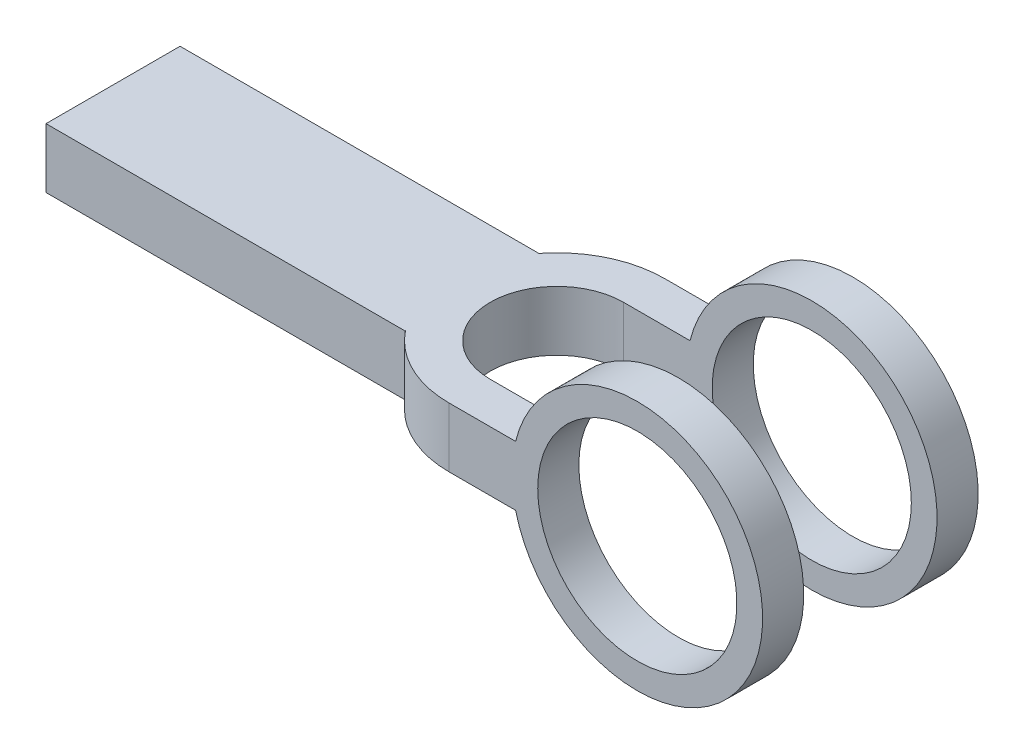
ISO-10303-21;
HEADER;
FILE_DESCRIPTION(('STEP AP214'),'2;1');
FILE_NAME('part.step','',(''),(''),'','','');
FILE_SCHEMA(('AUTOMOTIVE_DESIGN { 1 0 10303 214 1 1 1 1 }'));
ENDSEC;
DATA;
#1=APPLICATION_CONTEXT('core data for automotive mechanical design processes');
#2=APPLICATION_PROTOCOL_DEFINITION('international standard','automotive_design',2000,#1);
#3=PRODUCT_CONTEXT('',#1,'mechanical');
#4=PRODUCT('Part','Part','',(#3));
#5=PRODUCT_RELATED_PRODUCT_CATEGORY('part','',(#4));
#6=PRODUCT_DEFINITION_FORMATION('','',#4);
#7=PRODUCT_DEFINITION_CONTEXT('part definition',#1,'design');
#8=PRODUCT_DEFINITION('design','',#6,#7);
#9=PRODUCT_DEFINITION_SHAPE('','',#8);
#10=(LENGTH_UNIT() NAMED_UNIT(*) SI_UNIT(.MILLI.,.METRE.));
#11=(NAMED_UNIT(*) PLANE_ANGLE_UNIT() SI_UNIT($,.RADIAN.));
#12=(NAMED_UNIT(*) SI_UNIT($,.STERADIAN.) SOLID_ANGLE_UNIT());
#13=UNCERTAINTY_MEASURE_WITH_UNIT(LENGTH_MEASURE(1.E-05),#10,'distance_accuracy_value','');
#14=(GEOMETRIC_REPRESENTATION_CONTEXT(3) GLOBAL_UNCERTAINTY_ASSIGNED_CONTEXT((#13)) GLOBAL_UNIT_ASSIGNED_CONTEXT((#10,
#11,#12)) REPRESENTATION_CONTEXT('',''));
#15=CARTESIAN_POINT('',(0.,0.,0.));
#16=DIRECTION('',(0.,0.,1.));
#17=DIRECTION('',(1.,0.,0.));
#18=AXIS2_PLACEMENT_3D('',#15,#16,#17);
#19=CARTESIAN_POINT('',(0.,21.,0.));
#20=DIRECTION('',(0.,-1.,0.));
#21=DIRECTION('',(0.,0.,-1.));
#22=AXIS2_PLACEMENT_3D('',#19,#20,#21);
#23=CYLINDRICAL_SURFACE('',#22,37.9240002090034);
#24=CARTESIAN_POINT('',(0.,0.,0.));
#25=DIRECTION('',(0.,1.,0.));
#26=DIRECTION('',(0.,0.,1.));
#27=AXIS2_PLACEMENT_3D('',#24,#25,#26);
#28=CIRCLE('',#27,37.9240002090034);
#29=CARTESIAN_POINT('',(-29.7983234613521,0.,23.4582546397878));
#30=VERTEX_POINT('',#29);
#31=CARTESIAN_POINT('',(0.,0.,37.9240002090034));
#32=VERTEX_POINT('',#31);
#33=EDGE_CURVE('E150',#30,#32,#28,.T.);
#34=ORIENTED_EDGE('',*,*,#33,.T.);
#35=DIRECTION('',(0.,-1.,0.));
#36=VECTOR('',#35,1.);
#37=CARTESIAN_POINT('',(0.,21.,37.9240002090034));
#38=LINE('',#37,#36);
#39=CARTESIAN_POINT('',(0.,21.,37.9240002090034));
#40=VERTEX_POINT('',#39);
#41=EDGE_CURVE('E190',#40,#32,#38,.T.);
#42=ORIENTED_EDGE('',*,*,#41,.F.);
#43=CARTESIAN_POINT('',(0.,21.,0.));
#44=DIRECTION('',(0.,1.,0.));
#45=DIRECTION('',(0.,0.,1.));
#46=AXIS2_PLACEMENT_3D('',#43,#44,#45);
#47=CIRCLE('',#46,37.9240002090034);
#48=CARTESIAN_POINT('',(-29.7983234613521,21.,23.4582546397878));
#49=VERTEX_POINT('',#48);
#50=EDGE_CURVE('E174',#49,#40,#47,.T.);
#51=ORIENTED_EDGE('',*,*,#50,.F.);
#52=DIRECTION('',(0.,-1.,0.));
#53=VECTOR('',#52,1.);
#54=CARTESIAN_POINT('',(-29.7983234613521,21.,23.4582546397878));
#55=LINE('',#54,#53);
#56=EDGE_CURVE('E146',#49,#30,#55,.T.);
#57=ORIENTED_EDGE('',*,*,#56,.T.);
#58=EDGE_LOOP('',(#34,#42,#51,#57));
#59=FACE_BOUND('',#58,.T.);
#60=ADVANCED_FACE('F35',(#59),#23,.T.);
#61=CARTESIAN_POINT('',(23.7123231236156,21.,37.9240002090034));
#62=DIRECTION('',(0.,0.,-1.));
#63=DIRECTION('',(-1.,0.,0.));
#64=AXIS2_PLACEMENT_3D('',#61,#62,#63);
#65=PLANE('',#64);
#66=DIRECTION('',(1.,0.,0.));
#67=VECTOR('',#66,1.);
#68=CARTESIAN_POINT('',(23.7123231236156,0.,37.9240002090034));
#69=LINE('',#68,#67);
#70=CARTESIAN_POINT('',(23.4010746666968,0.,37.9240002090034));
#71=VERTEX_POINT('',#70);
#72=EDGE_CURVE('E153',#32,#71,#69,.T.);
#73=ORIENTED_EDGE('',*,*,#72,.T.);
#74=CARTESIAN_POINT('',(66.2252808729199,10.5,37.9240002090034));
#75=DIRECTION('',(0.,0.,-1.));
#76=DIRECTION('',(-1.,0.,0.));
#77=AXIS2_PLACEMENT_3D('',#74,#75,#76);
#78=CIRCLE('',#77,44.0926596747476);
#79=CARTESIAN_POINT('',(23.4010746666968,21.,37.9240002090034));
#80=VERTEX_POINT('',#79);
#81=EDGE_CURVE('E236',#71,#80,#78,.F.);
#82=ORIENTED_EDGE('',*,*,#81,.T.);
#83=DIRECTION('',(1.,0.,0.));
#84=VECTOR('',#83,1.);
#85=CARTESIAN_POINT('',(23.7123231236156,21.,37.9240002090034));
#86=LINE('',#85,#84);
#87=EDGE_CURVE('E102',#40,#80,#86,.T.);
#88=ORIENTED_EDGE('',*,*,#87,.F.);
#89=ORIENTED_EDGE('',*,*,#41,.T.);
#90=EDGE_LOOP('',(#73,#82,#88,#89));
#91=FACE_BOUND('',#90,.T.);
#92=CARTESIAN_POINT('',(66.2252808729199,10.5,37.9240002090034));
#93=DIRECTION('',(0.,0.,-1.));
#94=DIRECTION('',(-1.,0.,0.));
#95=AXIS2_PLACEMENT_3D('',#92,#93,#94);
#96=CIRCLE('',#95,35.0395066934959);
#97=CARTESIAN_POINT('',(31.1857741794241,10.5,37.9240002090034));
#98=VERTEX_POINT('',#97);
#99=EDGE_CURVE('E232',#98,#98,#96,.F.);
#100=ORIENTED_EDGE('',*,*,#99,.F.);
#101=EDGE_LOOP('',(#100));
#102=FACE_BOUND('',#101,.T.);
#103=ADVANCED_FACE('F302',(#91,#102),#65,.F.);
#104=CARTESIAN_POINT('',(0.,21.,23.4582546397878));
#105=DIRECTION('',(0.,0.,1.));
#106=DIRECTION('',(1.,0.,0.));
#107=AXIS2_PLACEMENT_3D('',#104,#105,#106);
#108=PLANE('',#107);
#109=DIRECTION('',(-1.,0.,0.));
#110=VECTOR('',#109,1.);
#111=CARTESIAN_POINT('',(0.,21.,23.4582546397878));
#112=LINE('',#111,#110);
#113=CARTESIAN_POINT('',(23.4010746666968,21.,23.4582546397878));
#114=VERTEX_POINT('',#113);
#115=CARTESIAN_POINT('',(0.,21.,23.4582546397878));
#116=VERTEX_POINT('',#115);
#117=EDGE_CURVE('E229',#114,#116,#112,.T.);
#118=ORIENTED_EDGE('',*,*,#117,.F.);
#119=CARTESIAN_POINT('',(66.2252808729199,10.5,23.4582546397878));
#120=DIRECTION('',(0.,0.,-1.));
#121=DIRECTION('',(-1.,0.,0.));
#122=AXIS2_PLACEMENT_3D('',#119,#120,#121);
#123=CIRCLE('',#122,44.0926596747476);
#124=CARTESIAN_POINT('',(23.4010746666968,0.,23.4582546397878));
#125=VERTEX_POINT('',#124);
#126=EDGE_CURVE('E228',#114,#125,#123,.T.);
#127=ORIENTED_EDGE('',*,*,#126,.T.);
#128=DIRECTION('',(-1.,0.,0.));
#129=VECTOR('',#128,1.);
#130=CARTESIAN_POINT('',(0.,0.,23.4582546397878));
#131=LINE('',#130,#129);
#132=CARTESIAN_POINT('',(0.,0.,23.4582546397878));
#133=VERTEX_POINT('',#132);
#134=EDGE_CURVE('E157',#125,#133,#131,.T.);
#135=ORIENTED_EDGE('',*,*,#134,.T.);
#136=DIRECTION('',(0.,-1.,0.));
#137=VECTOR('',#136,1.);
#138=CARTESIAN_POINT('',(0.,21.,23.4582546397878));
#139=LINE('',#138,#137);
#140=EDGE_CURVE('E187',#116,#133,#139,.T.);
#141=ORIENTED_EDGE('',*,*,#140,.F.);
#142=EDGE_LOOP('',(#118,#127,#135,#141));
#143=FACE_BOUND('',#142,.T.);
#144=CARTESIAN_POINT('',(66.2252808729199,10.5,23.4582546397878));
#145=DIRECTION('',(0.,0.,-1.));
#146=DIRECTION('',(-1.,0.,0.));
#147=AXIS2_PLACEMENT_3D('',#144,#145,#146);
#148=CIRCLE('',#147,35.0395066934959);
#149=CARTESIAN_POINT('',(31.1857741794241,10.5,23.4582546397878));
#150=VERTEX_POINT('',#149);
#151=EDGE_CURVE('E233',#150,#150,#148,.T.);
#152=ORIENTED_EDGE('',*,*,#151,.F.);
#153=EDGE_LOOP('',(#152));
#154=FACE_BOUND('',#153,.T.);
#155=ADVANCED_FACE('F225',(#143,#154),#108,.F.);
#156=CARTESIAN_POINT('',(0.,21.,0.));
#157=DIRECTION('',(0.,-1.,0.));
#158=DIRECTION('',(0.,0.,-1.));
#159=AXIS2_PLACEMENT_3D('',#156,#157,#158);
#160=CYLINDRICAL_SURFACE('',#159,23.4582546397878);
#161=CARTESIAN_POINT('',(0.,0.,0.));
#162=DIRECTION('',(0.,-1.,0.));
#163=DIRECTION('',(0.,0.,1.));
#164=AXIS2_PLACEMENT_3D('',#161,#162,#163);
#165=CIRCLE('',#164,23.4582546397878);
#166=CARTESIAN_POINT('',(0.,0.,-23.4582546397878));
#167=VERTEX_POINT('',#166);
#168=EDGE_CURVE('E159',#133,#167,#165,.T.);
#169=ORIENTED_EDGE('',*,*,#168,.T.);
#170=DIRECTION('',(0.,-1.,0.));
#171=VECTOR('',#170,1.);
#172=CARTESIAN_POINT('',(0.,21.,-23.4582546397878));
#173=LINE('',#172,#171);
#174=CARTESIAN_POINT('',(0.,21.,-23.4582546397878));
#175=VERTEX_POINT('',#174);
#176=EDGE_CURVE('E184',#175,#167,#173,.T.);
#177=ORIENTED_EDGE('',*,*,#176,.F.);
#178=CARTESIAN_POINT('',(0.,21.,0.));
#179=DIRECTION('',(0.,-1.,0.));
#180=DIRECTION('',(0.,0.,1.));
#181=AXIS2_PLACEMENT_3D('',#178,#179,#180);
#182=CIRCLE('',#181,23.4582546397878);
#183=EDGE_CURVE('E214',#116,#175,#182,.T.);
#184=ORIENTED_EDGE('',*,*,#183,.F.);
#185=ORIENTED_EDGE('',*,*,#140,.T.);
#186=EDGE_LOOP('',(#169,#177,#184,#185));
#187=FACE_BOUND('',#186,.T.);
#188=ADVANCED_FACE('F213',(#187),#160,.F.);
#189=CARTESIAN_POINT('',(23.7123231236156,21.,-23.4582546397878));
#190=DIRECTION('',(0.,0.,-1.));
#191=DIRECTION('',(-1.,0.,0.));
#192=AXIS2_PLACEMENT_3D('',#189,#190,#191);
#193=PLANE('',#192);
#194=DIRECTION('',(1.,0.,0.));
#195=VECTOR('',#194,1.);
#196=CARTESIAN_POINT('',(23.7123231236156,0.,-23.4582546397878));
#197=LINE('',#196,#195);
#198=CARTESIAN_POINT('',(23.4010746666968,0.,-23.4582546397878));
#199=VERTEX_POINT('',#198);
#200=EDGE_CURVE('E161',#167,#199,#197,.T.);
#201=ORIENTED_EDGE('',*,*,#200,.T.);
#202=CARTESIAN_POINT('',(66.2252808729199,10.5,-23.4582546397878));
#203=DIRECTION('',(0.,0.,1.));
#204=DIRECTION('',(1.,0.,0.));
#205=AXIS2_PLACEMENT_3D('',#202,#203,#204);
#206=CIRCLE('',#205,44.0926596747476);
#207=CARTESIAN_POINT('',(23.4010746666968,21.,-23.4582546397878));
#208=VERTEX_POINT('',#207);
#209=EDGE_CURVE('E207',#199,#208,#206,.T.);
#210=ORIENTED_EDGE('',*,*,#209,.T.);
#211=DIRECTION('',(1.,0.,0.));
#212=VECTOR('',#211,1.);
#213=CARTESIAN_POINT('',(23.7123231236156,21.,-23.4582546397878));
#214=LINE('',#213,#212);
#215=EDGE_CURVE('E210',#175,#208,#214,.T.);
#216=ORIENTED_EDGE('',*,*,#215,.F.);
#217=ORIENTED_EDGE('',*,*,#176,.T.);
#218=EDGE_LOOP('',(#201,#210,#216,#217));
#219=FACE_BOUND('',#218,.T.);
#220=CARTESIAN_POINT('',(66.2252808729199,10.5,-23.4582546397878));
#221=DIRECTION('',(0.,0.,1.));
#222=DIRECTION('',(1.,0.,0.));
#223=AXIS2_PLACEMENT_3D('',#220,#221,#222);
#224=CIRCLE('',#223,35.0395066934959);
#225=CARTESIAN_POINT('',(101.264787566416,10.5,-23.4582546397878));
#226=VERTEX_POINT('',#225);
#227=EDGE_CURVE('E244',#226,#226,#224,.T.);
#228=ORIENTED_EDGE('',*,*,#227,.F.);
#229=EDGE_LOOP('',(#228));
#230=FACE_BOUND('',#229,.T.);
#231=ADVANCED_FACE('F204',(#219,#230),#193,.F.);
#232=CARTESIAN_POINT('',(0.,21.,-37.9240002090034));
#233=DIRECTION('',(0.,0.,1.));
#234=DIRECTION('',(1.,0.,0.));
#235=AXIS2_PLACEMENT_3D('',#232,#233,#234);
#236=PLANE('',#235);
#237=DIRECTION('',(-1.,0.,0.));
#238=VECTOR('',#237,1.);
#239=CARTESIAN_POINT('',(0.,21.,-37.9240002090034));
#240=LINE('',#239,#238);
#241=CARTESIAN_POINT('',(23.4010746666968,21.,-37.9240002090034));
#242=VERTEX_POINT('',#241);
#243=CARTESIAN_POINT('',(0.,21.,-37.9240002090034));
#244=VERTEX_POINT('',#243);
#245=EDGE_CURVE('E259',#242,#244,#240,.T.);
#246=ORIENTED_EDGE('',*,*,#245,.F.);
#247=CARTESIAN_POINT('',(66.2252808729199,10.5,-37.9240002090034));
#248=DIRECTION('',(0.,0.,1.));
#249=DIRECTION('',(1.,0.,0.));
#250=AXIS2_PLACEMENT_3D('',#247,#248,#249);
#251=CIRCLE('',#250,44.0926596747476);
#252=CARTESIAN_POINT('',(23.4010746666968,0.,-37.9240002090034));
#253=VERTEX_POINT('',#252);
#254=EDGE_CURVE('E49',#242,#253,#251,.F.);
#255=ORIENTED_EDGE('',*,*,#254,.T.);
#256=DIRECTION('',(-1.,0.,0.));
#257=VECTOR('',#256,1.);
#258=CARTESIAN_POINT('',(0.,0.,-37.9240002090034));
#259=LINE('',#258,#257);
#260=CARTESIAN_POINT('',(0.,0.,-37.9240002090034));
#261=VERTEX_POINT('',#260);
#262=EDGE_CURVE('E164',#253,#261,#259,.T.);
#263=ORIENTED_EDGE('',*,*,#262,.T.);
#264=DIRECTION('',(0.,-1.,0.));
#265=VECTOR('',#264,1.);
#266=CARTESIAN_POINT('',(0.,21.,-37.9240002090034));
#267=LINE('',#266,#265);
#268=EDGE_CURVE('E181',#244,#261,#267,.T.);
#269=ORIENTED_EDGE('',*,*,#268,.F.);
#270=EDGE_LOOP('',(#246,#255,#263,#269));
#271=FACE_BOUND('',#270,.T.);
#272=CARTESIAN_POINT('',(66.2252808729199,10.5,-37.9240002090034));
#273=DIRECTION('',(0.,0.,1.));
#274=DIRECTION('',(1.,0.,0.));
#275=AXIS2_PLACEMENT_3D('',#272,#273,#274);
#276=CIRCLE('',#275,35.0395066934959);
#277=CARTESIAN_POINT('',(101.264787566416,10.5,-37.9240002090034));
#278=VERTEX_POINT('',#277);
#279=EDGE_CURVE('E246',#278,#278,#276,.F.);
#280=ORIENTED_EDGE('',*,*,#279,.F.);
#281=EDGE_LOOP('',(#280));
#282=FACE_BOUND('',#281,.T.);
#283=ADVANCED_FACE('F283',(#271,#282),#236,.F.);
#284=CARTESIAN_POINT('',(0.,21.,0.));
#285=DIRECTION('',(0.,-1.,0.));
#286=DIRECTION('',(0.,0.,-1.));
#287=AXIS2_PLACEMENT_3D('',#284,#285,#286);
#288=CYLINDRICAL_SURFACE('',#287,37.9240002090034);
#289=CARTESIAN_POINT('',(0.,0.,0.));
#290=DIRECTION('',(0.,1.,0.));
#291=DIRECTION('',(0.,0.,1.));
#292=AXIS2_PLACEMENT_3D('',#289,#290,#291);
#293=CIRCLE('',#292,37.9240002090034);
#294=CARTESIAN_POINT('',(-29.7983234613521,0.,-23.4582546397878));
#295=VERTEX_POINT('',#294);
#296=EDGE_CURVE('E166',#261,#295,#293,.T.);
#297=ORIENTED_EDGE('',*,*,#296,.T.);
#298=DIRECTION('',(0.,-1.,0.));
#299=VECTOR('',#298,1.);
#300=CARTESIAN_POINT('',(-29.7983234613521,21.,-23.4582546397878));
#301=LINE('',#300,#299);
#302=CARTESIAN_POINT('',(-29.7983234613521,21.,-23.4582546397878));
#303=VERTEX_POINT('',#302);
#304=EDGE_CURVE('E178',#303,#295,#301,.T.);
#305=ORIENTED_EDGE('',*,*,#304,.F.);
#306=CARTESIAN_POINT('',(0.,21.,0.));
#307=DIRECTION('',(0.,1.,0.));
#308=DIRECTION('',(0.,0.,1.));
#309=AXIS2_PLACEMENT_3D('',#306,#307,#308);
#310=CIRCLE('',#309,37.9240002090034);
#311=EDGE_CURVE('E261',#244,#303,#310,.T.);
#312=ORIENTED_EDGE('',*,*,#311,.F.);
#313=ORIENTED_EDGE('',*,*,#268,.T.);
#314=EDGE_LOOP('',(#297,#305,#312,#313));
#315=FACE_BOUND('',#314,.T.);
#316=ADVANCED_FACE('F267',(#315),#288,.T.);
#317=CARTESIAN_POINT('',(-29.7983234613521,21.,-23.4582546397878));
#318=DIRECTION('',(0.,0.,1.));
#319=DIRECTION('',(1.,0.,0.));
#320=AXIS2_PLACEMENT_3D('',#317,#318,#319);
#321=PLANE('',#320);
#322=DIRECTION('',(-1.,0.,0.));
#323=VECTOR('',#322,1.);
#324=CARTESIAN_POINT('',(-29.7983234613521,0.,-23.4582546397878));
#325=LINE('',#324,#323);
#326=CARTESIAN_POINT('',(-156.054398776884,0.,-23.4582546397878));
#327=VERTEX_POINT('',#326);
#328=EDGE_CURVE('E168',#295,#327,#325,.T.);
#329=ORIENTED_EDGE('',*,*,#328,.T.);
#330=DIRECTION('',(0.,-1.,0.));
#331=VECTOR('',#330,1.);
#332=CARTESIAN_POINT('',(-156.054398776884,21.,-23.4582546397878));
#333=LINE('',#332,#331);
#334=CARTESIAN_POINT('',(-156.054398776884,21.,-23.4582546397878));
#335=VERTEX_POINT('',#334);
#336=EDGE_CURVE('E141',#335,#327,#333,.T.);
#337=ORIENTED_EDGE('',*,*,#336,.F.);
#338=DIRECTION('',(-1.,0.,0.));
#339=VECTOR('',#338,1.);
#340=CARTESIAN_POINT('',(-29.7983234613521,21.,-23.4582546397878));
#341=LINE('',#340,#339);
#342=EDGE_CURVE('E129',#303,#335,#341,.T.);
#343=ORIENTED_EDGE('',*,*,#342,.F.);
#344=ORIENTED_EDGE('',*,*,#304,.T.);
#345=EDGE_LOOP('',(#329,#337,#343,#344));
#346=FACE_BOUND('',#345,.T.);
#347=ADVANCED_FACE('F270',(#346),#321,.F.);
#348=CARTESIAN_POINT('',(-156.054398776884,21.,-23.4582546397878));
#349=DIRECTION('',(1.,0.,0.));
#350=DIRECTION('',(0.,0.,-1.));
#351=AXIS2_PLACEMENT_3D('',#348,#349,#350);
#352=PLANE('',#351);
#353=DIRECTION('',(0.,0.,1.));
#354=VECTOR('',#353,1.);
#355=CARTESIAN_POINT('',(-156.054398776884,0.,-23.4582546397878));
#356=LINE('',#355,#354);
#357=CARTESIAN_POINT('',(-156.054398776884,0.,23.7123231236156));
#358=VERTEX_POINT('',#357);
#359=EDGE_CURVE('E138',#327,#358,#356,.T.);
#360=ORIENTED_EDGE('',*,*,#359,.T.);
#361=DIRECTION('',(0.,-1.,0.));
#362=VECTOR('',#361,1.);
#363=CARTESIAN_POINT('',(-156.054398776884,21.,23.7123231236156));
#364=LINE('',#363,#362);
#365=CARTESIAN_POINT('',(-156.054398776884,21.,23.7123231236156));
#366=VERTEX_POINT('',#365);
#367=EDGE_CURVE('E135',#366,#358,#364,.T.);
#368=ORIENTED_EDGE('',*,*,#367,.F.);
#369=DIRECTION('',(0.,0.,1.));
#370=VECTOR('',#369,1.);
#371=CARTESIAN_POINT('',(-156.054398776884,21.,-23.4582546397878));
#372=LINE('',#371,#370);
#373=EDGE_CURVE('E121',#335,#366,#372,.T.);
#374=ORIENTED_EDGE('',*,*,#373,.F.);
#375=ORIENTED_EDGE('',*,*,#336,.T.);
#376=EDGE_LOOP('',(#360,#368,#374,#375));
#377=FACE_BOUND('',#376,.T.);
#378=ADVANCED_FACE('F136',(#377),#352,.F.);
#379=CARTESIAN_POINT('',(-29.7983234613521,21.,23.7123231236156));
#380=DIRECTION('',(0.,0.,-1.));
#381=DIRECTION('',(-1.,0.,0.));
#382=AXIS2_PLACEMENT_3D('',#379,#380,#381);
#383=PLANE('',#382);
#384=DIRECTION('',(1.,0.,0.));
#385=VECTOR('',#384,1.);
#386=CARTESIAN_POINT('',(-29.7983234613521,0.,23.7123231236156));
#387=LINE('',#386,#385);
#388=CARTESIAN_POINT('',(-29.7983234613521,0.,23.7123231236156));
#389=VERTEX_POINT('',#388);
#390=EDGE_CURVE('E171',#358,#389,#387,.T.);
#391=ORIENTED_EDGE('',*,*,#390,.T.);
#392=DIRECTION('',(0.,-1.,0.));
#393=VECTOR('',#392,1.);
#394=CARTESIAN_POINT('',(-29.7983234613521,21.,23.7123231236156));
#395=LINE('',#394,#393);
#396=CARTESIAN_POINT('',(-29.7983234613521,21.,23.7123231236156));
#397=VERTEX_POINT('',#396);
#398=EDGE_CURVE('E142',#397,#389,#395,.T.);
#399=ORIENTED_EDGE('',*,*,#398,.F.);
#400=DIRECTION('',(1.,0.,0.));
#401=VECTOR('',#400,1.);
#402=CARTESIAN_POINT('',(-29.7983234613521,21.,23.7123231236156));
#403=LINE('',#402,#401);
#404=EDGE_CURVE('E126',#366,#397,#403,.T.);
#405=ORIENTED_EDGE('',*,*,#404,.F.);
#406=ORIENTED_EDGE('',*,*,#367,.T.);
#407=EDGE_LOOP('',(#391,#399,#405,#406));
#408=FACE_BOUND('',#407,.T.);
#409=ADVANCED_FACE('F144',(#408),#383,.F.);
#410=CARTESIAN_POINT('',(-29.7983234613521,21.,23.4582546397878));
#411=DIRECTION('',(-1.,0.,0.));
#412=DIRECTION('',(0.,0.,1.));
#413=AXIS2_PLACEMENT_3D('',#410,#411,#412);
#414=PLANE('',#413);
#415=DIRECTION('',(0.,0.,-1.));
#416=VECTOR('',#415,1.);
#417=CARTESIAN_POINT('',(-29.7983234613521,0.,23.4582546397878));
#418=LINE('',#417,#416);
#419=EDGE_CURVE('E93',#389,#30,#418,.T.);
#420=ORIENTED_EDGE('',*,*,#419,.T.);
#421=ORIENTED_EDGE('',*,*,#56,.F.);
#422=DIRECTION('',(0.,0.,-1.));
#423=VECTOR('',#422,1.);
#424=CARTESIAN_POINT('',(-29.7983234613521,21.,23.4582546397878));
#425=LINE('',#424,#423);
#426=EDGE_CURVE('E58',#397,#49,#425,.T.);
#427=ORIENTED_EDGE('',*,*,#426,.F.);
#428=ORIENTED_EDGE('',*,*,#398,.T.);
#429=EDGE_LOOP('',(#420,#421,#427,#428));
#430=FACE_BOUND('',#429,.T.);
#431=ADVANCED_FACE('F272',(#430),#414,.F.);
#432=CARTESIAN_POINT('',(0.,21.,0.));
#433=DIRECTION('',(0.,1.,0.));
#434=DIRECTION('',(0.,0.,1.));
#435=AXIS2_PLACEMENT_3D('',#432,#433,#434);
#436=PLANE('',#435);
#437=DIRECTION('',(0.,0.,-1.));
#438=VECTOR('',#437,1.);
#439=CARTESIAN_POINT('',(23.4010746666969,21.,162.636874835262));
#440=LINE('',#439,#438);
#441=EDGE_CURVE('E242',#114,#80,#440,.F.);
#442=ORIENTED_EDGE('',*,*,#441,.F.);
#443=ORIENTED_EDGE('',*,*,#117,.T.);
#444=ORIENTED_EDGE('',*,*,#183,.T.);
#445=ORIENTED_EDGE('',*,*,#215,.T.);
#446=DIRECTION('',(0.,0.,1.));
#447=VECTOR('',#446,1.);
#448=CARTESIAN_POINT('',(23.4010746666968,21.,-162.636874835262));
#449=LINE('',#448,#447);
#450=EDGE_CURVE('E154',#242,#208,#449,.T.);
#451=ORIENTED_EDGE('',*,*,#450,.F.);
#452=ORIENTED_EDGE('',*,*,#245,.T.);
#453=ORIENTED_EDGE('',*,*,#311,.T.);
#454=ORIENTED_EDGE('',*,*,#342,.T.);
#455=ORIENTED_EDGE('',*,*,#373,.T.);
#456=ORIENTED_EDGE('',*,*,#404,.T.);
#457=ORIENTED_EDGE('',*,*,#426,.T.);
#458=ORIENTED_EDGE('',*,*,#50,.T.);
#459=ORIENTED_EDGE('',*,*,#87,.T.);
#460=EDGE_LOOP('',(#442,#443,#444,#445,#451,#452,#453,#454,#455,#456,#457,#458,#459));
#461=FACE_BOUND('',#460,.T.);
#462=ADVANCED_FACE('F124',(#461),#436,.T.);
#463=CARTESIAN_POINT('',(0.,0.,0.));
#464=DIRECTION('',(0.,1.,0.));
#465=DIRECTION('',(0.,0.,1.));
#466=AXIS2_PLACEMENT_3D('',#463,#464,#465);
#467=PLANE('',#466);
#468=ORIENTED_EDGE('',*,*,#134,.F.);
#469=DIRECTION('',(0.,0.,-1.));
#470=VECTOR('',#469,1.);
#471=CARTESIAN_POINT('',(23.4010746666969,0.,162.636874835262));
#472=LINE('',#471,#470);
#473=EDGE_CURVE('E11',#125,#71,#472,.F.);
#474=ORIENTED_EDGE('',*,*,#473,.T.);
#475=ORIENTED_EDGE('',*,*,#72,.F.);
#476=ORIENTED_EDGE('',*,*,#33,.F.);
#477=ORIENTED_EDGE('',*,*,#419,.F.);
#478=ORIENTED_EDGE('',*,*,#390,.F.);
#479=ORIENTED_EDGE('',*,*,#359,.F.);
#480=ORIENTED_EDGE('',*,*,#328,.F.);
#481=ORIENTED_EDGE('',*,*,#296,.F.);
#482=ORIENTED_EDGE('',*,*,#262,.F.);
#483=DIRECTION('',(0.,0.,1.));
#484=VECTOR('',#483,1.);
#485=CARTESIAN_POINT('',(23.4010746666968,0.,-162.636874835262));
#486=LINE('',#485,#484);
#487=EDGE_CURVE('E42',#253,#199,#486,.T.);
#488=ORIENTED_EDGE('',*,*,#487,.T.);
#489=ORIENTED_EDGE('',*,*,#200,.F.);
#490=ORIENTED_EDGE('',*,*,#168,.F.);
#491=EDGE_LOOP('',(#468,#474,#475,#476,#477,#478,#479,#480,#481,#482,#488,#489,#490));
#492=FACE_BOUND('',#491,.T.);
#493=ADVANCED_FACE('F196',(#492),#467,.F.);
#494=CARTESIAN_POINT('',(66.2252808729199,10.5,-162.636874835262));
#495=DIRECTION('',(0.,0.,1.));
#496=DIRECTION('',(1.,0.,0.));
#497=AXIS2_PLACEMENT_3D('',#494,#495,#496);
#498=CYLINDRICAL_SURFACE('',#497,44.0926596747476);
#499=ORIENTED_EDGE('',*,*,#254,.F.);
#500=ORIENTED_EDGE('',*,*,#450,.T.);
#501=ORIENTED_EDGE('',*,*,#209,.F.);
#502=ORIENTED_EDGE('',*,*,#487,.F.);
#503=EDGE_LOOP('',(#499,#500,#501,#502));
#504=FACE_BOUND('',#503,.T.);
#505=ADVANCED_FACE('F282',(#504),#498,.T.);
#506=CARTESIAN_POINT('',(66.2252808729199,10.5,-162.636874835262));
#507=DIRECTION('',(0.,0.,1.));
#508=DIRECTION('',(1.,0.,0.));
#509=AXIS2_PLACEMENT_3D('',#506,#507,#508);
#510=CYLINDRICAL_SURFACE('',#509,35.0395066934959);
#511=ORIENTED_EDGE('',*,*,#279,.T.);
#512=EDGE_LOOP('',(#511));
#513=FACE_BOUND('',#512,.T.);
#514=ORIENTED_EDGE('',*,*,#227,.T.);
#515=EDGE_LOOP('',(#514));
#516=FACE_BOUND('',#515,.T.);
#517=ADVANCED_FACE('F289',(#513,#516),#510,.F.);
#518=CARTESIAN_POINT('',(66.2252808729199,10.5,162.636874835262));
#519=DIRECTION('',(0.,0.,-1.));
#520=DIRECTION('',(-1.,0.,0.));
#521=AXIS2_PLACEMENT_3D('',#518,#519,#520);
#522=CYLINDRICAL_SURFACE('',#521,44.0926596747476);
#523=ORIENTED_EDGE('',*,*,#126,.F.);
#524=ORIENTED_EDGE('',*,*,#441,.T.);
#525=ORIENTED_EDGE('',*,*,#81,.F.);
#526=ORIENTED_EDGE('',*,*,#473,.F.);
#527=EDGE_LOOP('',(#523,#524,#525,#526));
#528=FACE_BOUND('',#527,.T.);
#529=ADVANCED_FACE('F292',(#528),#522,.T.);
#530=CARTESIAN_POINT('',(66.2252808729199,10.5,162.636874835262));
#531=DIRECTION('',(0.,0.,-1.));
#532=DIRECTION('',(-1.,0.,0.));
#533=AXIS2_PLACEMENT_3D('',#530,#531,#532);
#534=CYLINDRICAL_SURFACE('',#533,35.0395066934959);
#535=ORIENTED_EDGE('',*,*,#99,.T.);
#536=EDGE_LOOP('',(#535));
#537=FACE_BOUND('',#536,.T.);
#538=ORIENTED_EDGE('',*,*,#151,.T.);
#539=EDGE_LOOP('',(#538));
#540=FACE_BOUND('',#539,.T.);
#541=ADVANCED_FACE('F313',(#537,#540),#534,.F.);
#542=CLOSED_SHELL('',(#60,#103,#155,#188,#231,#283,#316,#347,#378,#409,#431,#462,#493,#505,#517,
#529,#541));
#543=MANIFOLD_SOLID_BREP('B2',#542);
#544=ADVANCED_BREP_SHAPE_REPRESENTATION('',(#18,#543),#14);
#545=SHAPE_DEFINITION_REPRESENTATION(#9,#544);
ENDSEC;
END-ISO-10303-21;
